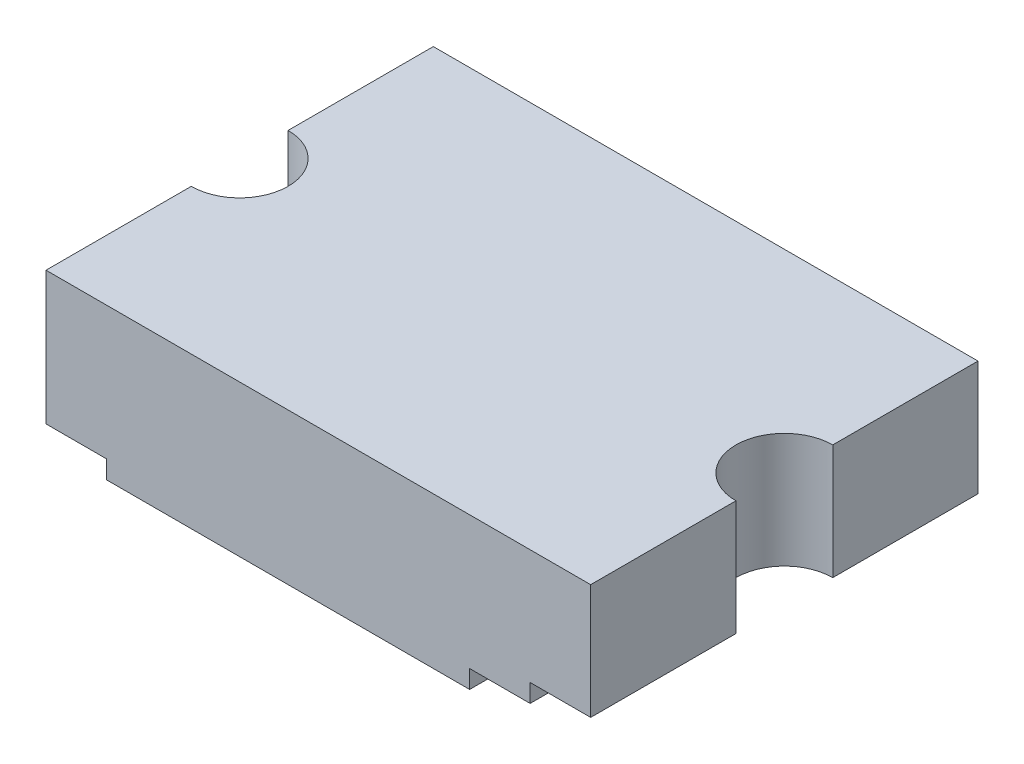
ISO-10303-21;
HEADER;
FILE_DESCRIPTION(('STEP AP214'),'2;1');
FILE_NAME('part.step','',(''),(''),'','','');
FILE_SCHEMA(('AUTOMOTIVE_DESIGN { 1 0 10303 214 1 1 1 1 }'));
ENDSEC;
DATA;
#1=APPLICATION_CONTEXT('core data for automotive mechanical design processes');
#2=APPLICATION_PROTOCOL_DEFINITION('international standard','automotive_design',2000,#1);
#3=PRODUCT_CONTEXT('',#1,'mechanical');
#4=PRODUCT('Part','Part','',(#3));
#5=PRODUCT_RELATED_PRODUCT_CATEGORY('part','',(#4));
#6=PRODUCT_DEFINITION_FORMATION('','',#4);
#7=PRODUCT_DEFINITION_CONTEXT('part definition',#1,'design');
#8=PRODUCT_DEFINITION('design','',#6,#7);
#9=PRODUCT_DEFINITION_SHAPE('','',#8);
#10=(LENGTH_UNIT() NAMED_UNIT(*) SI_UNIT(.MILLI.,.METRE.));
#11=(NAMED_UNIT(*) PLANE_ANGLE_UNIT() SI_UNIT($,.RADIAN.));
#12=(NAMED_UNIT(*) SI_UNIT($,.STERADIAN.) SOLID_ANGLE_UNIT());
#13=UNCERTAINTY_MEASURE_WITH_UNIT(LENGTH_MEASURE(1.E-05),#10,'distance_accuracy_value','');
#14=(GEOMETRIC_REPRESENTATION_CONTEXT(3) GLOBAL_UNCERTAINTY_ASSIGNED_CONTEXT((#13)) GLOBAL_UNIT_ASSIGNED_CONTEXT((#10,
#11,#12)) REPRESENTATION_CONTEXT('',''));
#15=CARTESIAN_POINT('',(0.,0.,0.));
#16=DIRECTION('',(0.,0.,1.));
#17=DIRECTION('',(1.,0.,0.));
#18=AXIS2_PLACEMENT_3D('',#15,#16,#17);
#19=CARTESIAN_POINT('',(2.25,-0.325,0.));
#20=DIRECTION('',(0.,-1.,0.));
#21=DIRECTION('',(0.,0.,-1.));
#22=AXIS2_PLACEMENT_3D('',#19,#20,#21);
#23=PLANE('',#22);
#24=DIRECTION('',(1.,0.,0.));
#25=VECTOR('',#24,1.);
#26=CARTESIAN_POINT('',(2.25,-0.325,-1.6));
#27=LINE('',#26,#25);
#28=CARTESIAN_POINT('',(1.75,-0.325,-1.6));
#29=VERTEX_POINT('',#28);
#30=CARTESIAN_POINT('',(2.25,-0.325,-1.6));
#31=VERTEX_POINT('',#30);
#32=EDGE_CURVE('E171',#29,#31,#27,.T.);
#33=ORIENTED_EDGE('',*,*,#32,.T.);
#34=DIRECTION('',(0.,0.,-1.));
#35=VECTOR('',#34,1.);
#36=CARTESIAN_POINT('',(2.25,-0.325,0.));
#37=LINE('',#36,#35);
#38=CARTESIAN_POINT('',(2.25,-0.325,-0.400000000000002));
#39=VERTEX_POINT('',#38);
#40=EDGE_CURVE('E169',#31,#39,#37,.F.);
#41=ORIENTED_EDGE('',*,*,#40,.T.);
#42=CARTESIAN_POINT('',(2.25,-0.325,0.));
#43=DIRECTION('',(0.,1.,0.));
#44=DIRECTION('',(0.,0.,1.));
#45=AXIS2_PLACEMENT_3D('',#42,#43,#44);
#46=CIRCLE('',#45,0.4);
#47=CARTESIAN_POINT('',(2.25,-0.325,0.399999999999999));
#48=VERTEX_POINT('',#47);
#49=EDGE_CURVE('E20',#39,#48,#46,.T.);
#50=ORIENTED_EDGE('',*,*,#49,.T.);
#51=DIRECTION('',(0.,0.,-1.));
#52=VECTOR('',#51,1.);
#53=CARTESIAN_POINT('',(2.25,-0.325,0.));
#54=LINE('',#53,#52);
#55=CARTESIAN_POINT('',(2.25,-0.325,1.6));
#56=VERTEX_POINT('',#55);
#57=EDGE_CURVE('E156',#48,#56,#54,.F.);
#58=ORIENTED_EDGE('',*,*,#57,.T.);
#59=DIRECTION('',(1.,0.,0.));
#60=VECTOR('',#59,1.);
#61=CARTESIAN_POINT('',(2.25,-0.325,1.6));
#62=LINE('',#61,#60);
#63=CARTESIAN_POINT('',(1.75,-0.325,1.6));
#64=VERTEX_POINT('',#63);
#65=EDGE_CURVE('E161',#56,#64,#62,.F.);
#66=ORIENTED_EDGE('',*,*,#65,.T.);
#67=DIRECTION('',(0.,0.,-1.));
#68=VECTOR('',#67,1.);
#69=CARTESIAN_POINT('',(1.75,-0.325,0.));
#70=LINE('',#69,#68);
#71=CARTESIAN_POINT('',(1.75,-0.325,0.748331477354788));
#72=VERTEX_POINT('',#71);
#73=EDGE_CURVE('E187',#64,#72,#70,.T.);
#74=ORIENTED_EDGE('',*,*,#73,.T.);
#75=CARTESIAN_POINT('',(2.25,-0.325,0.));
#76=DIRECTION('',(0.,-1.,0.));
#77=DIRECTION('',(0.,0.,-1.));
#78=AXIS2_PLACEMENT_3D('',#75,#76,#77);
#79=CIRCLE('',#78,0.9);
#80=CARTESIAN_POINT('',(1.75,-0.325,-0.74833147735479));
#81=VERTEX_POINT('',#80);
#82=EDGE_CURVE('E176',#72,#81,#79,.T.);
#83=ORIENTED_EDGE('',*,*,#82,.T.);
#84=DIRECTION('',(0.,0.,-1.));
#85=VECTOR('',#84,1.);
#86=CARTESIAN_POINT('',(1.75,-0.325,0.));
#87=LINE('',#86,#85);
#88=EDGE_CURVE('E178',#81,#29,#87,.T.);
#89=ORIENTED_EDGE('',*,*,#88,.T.);
#90=EDGE_LOOP('',(#33,#41,#50,#58,#66,#74,#83,#89));
#91=FACE_BOUND('',#90,.T.);
#92=ADVANCED_FACE('F17',(#91),#23,.T.);
#93=CARTESIAN_POINT('',(2.25,-0.325,0.));
#94=DIRECTION('',(0.,-1.,0.));
#95=DIRECTION('',(0.,0.,-1.));
#96=AXIS2_PLACEMENT_3D('',#93,#94,#95);
#97=CYLINDRICAL_SURFACE('',#96,0.9);
#98=DIRECTION('',(0.,-1.,0.));
#99=VECTOR('',#98,1.);
#100=CARTESIAN_POINT('',(1.75,-0.325,-0.74833147735479));
#101=LINE('',#100,#99);
#102=CARTESIAN_POINT('',(1.75,-0.475,-0.74833147735479));
#103=VERTEX_POINT('',#102);
#104=EDGE_CURVE('E233',#81,#103,#101,.T.);
#105=ORIENTED_EDGE('',*,*,#104,.F.);
#106=ORIENTED_EDGE('',*,*,#82,.F.);
#107=DIRECTION('',(0.,-1.,0.));
#108=VECTOR('',#107,1.);
#109=CARTESIAN_POINT('',(1.75,-0.325,0.748331477354788));
#110=LINE('',#109,#108);
#111=CARTESIAN_POINT('',(1.75,-0.475,0.748331477354788));
#112=VERTEX_POINT('',#111);
#113=EDGE_CURVE('E174',#112,#72,#110,.F.);
#114=ORIENTED_EDGE('',*,*,#113,.F.);
#115=CARTESIAN_POINT('',(2.25,-0.475,0.));
#116=DIRECTION('',(0.,-1.,0.));
#117=DIRECTION('',(0.,0.,-1.));
#118=AXIS2_PLACEMENT_3D('',#115,#116,#117);
#119=CIRCLE('',#118,0.9);
#120=EDGE_CURVE('E228',#103,#112,#119,.F.);
#121=ORIENTED_EDGE('',*,*,#120,.F.);
#122=EDGE_LOOP('',(#105,#106,#114,#121));
#123=FACE_BOUND('',#122,.T.);
#124=ADVANCED_FACE('F616',(#123),#97,.F.);
#125=CARTESIAN_POINT('',(2.25,-0.475,0.));
#126=DIRECTION('',(0.,-1.,0.));
#127=DIRECTION('',(0.,0.,-1.));
#128=AXIS2_PLACEMENT_3D('',#125,#126,#127);
#129=PLANE('',#128);
#130=DIRECTION('',(0.,0.,-1.));
#131=VECTOR('',#130,1.);
#132=CARTESIAN_POINT('',(1.25,-0.475,0.));
#133=LINE('',#132,#131);
#134=CARTESIAN_POINT('',(1.25,-0.475,-0.979795897113274));
#135=VERTEX_POINT('',#134);
#136=CARTESIAN_POINT('',(1.25,-0.475,-1.6));
#137=VERTEX_POINT('',#136);
#138=EDGE_CURVE('E294',#135,#137,#133,.T.);
#139=ORIENTED_EDGE('',*,*,#138,.T.);
#140=DIRECTION('',(1.,0.,0.));
#141=VECTOR('',#140,1.);
#142=CARTESIAN_POINT('',(2.25,-0.475,-1.6));
#143=LINE('',#142,#141);
#144=CARTESIAN_POINT('',(1.75,-0.475,-1.6));
#145=VERTEX_POINT('',#144);
#146=EDGE_CURVE('E291',#137,#145,#143,.T.);
#147=ORIENTED_EDGE('',*,*,#146,.T.);
#148=DIRECTION('',(0.,0.,-1.));
#149=VECTOR('',#148,1.);
#150=CARTESIAN_POINT('',(1.75,-0.475,0.));
#151=LINE('',#150,#149);
#152=EDGE_CURVE('E231',#145,#103,#151,.F.);
#153=ORIENTED_EDGE('',*,*,#152,.T.);
#154=ORIENTED_EDGE('',*,*,#120,.T.);
#155=DIRECTION('',(0.,0.,-1.));
#156=VECTOR('',#155,1.);
#157=CARTESIAN_POINT('',(1.75,-0.475,0.));
#158=LINE('',#157,#156);
#159=CARTESIAN_POINT('',(1.75,-0.475,1.6));
#160=VERTEX_POINT('',#159);
#161=EDGE_CURVE('E230',#112,#160,#158,.F.);
#162=ORIENTED_EDGE('',*,*,#161,.T.);
#163=DIRECTION('',(1.,0.,0.));
#164=VECTOR('',#163,1.);
#165=CARTESIAN_POINT('',(2.25,-0.475,1.6));
#166=LINE('',#165,#164);
#167=CARTESIAN_POINT('',(1.25,-0.475,1.6));
#168=VERTEX_POINT('',#167);
#169=EDGE_CURVE('E300',#160,#168,#166,.F.);
#170=ORIENTED_EDGE('',*,*,#169,.T.);
#171=DIRECTION('',(0.,0.,-1.));
#172=VECTOR('',#171,1.);
#173=CARTESIAN_POINT('',(1.25,-0.475,0.));
#174=LINE('',#173,#172);
#175=CARTESIAN_POINT('',(1.25,-0.475,0.979795897113272));
#176=VERTEX_POINT('',#175);
#177=EDGE_CURVE('E296',#168,#176,#174,.T.);
#178=ORIENTED_EDGE('',*,*,#177,.T.);
#179=CARTESIAN_POINT('',(2.25,-0.475,0.));
#180=DIRECTION('',(0.,-1.,0.));
#181=DIRECTION('',(0.,0.,-1.));
#182=AXIS2_PLACEMENT_3D('',#179,#180,#181);
#183=CIRCLE('',#182,1.4);
#184=EDGE_CURVE('E221',#176,#135,#183,.T.);
#185=ORIENTED_EDGE('',*,*,#184,.T.);
#186=EDGE_LOOP('',(#139,#147,#153,#154,#162,#170,#178,#185));
#187=FACE_BOUND('',#186,.T.);
#188=ADVANCED_FACE('F396',(#187),#129,.T.);
#189=CARTESIAN_POINT('',(-2.25,-0.475,0.));
#190=DIRECTION('',(0.,-1.,0.));
#191=DIRECTION('',(0.,0.,-1.));
#192=AXIS2_PLACEMENT_3D('',#189,#190,#191);
#193=PLANE('',#192);
#194=DIRECTION('',(0.,0.,-1.));
#195=VECTOR('',#194,1.);
#196=CARTESIAN_POINT('',(-2.25,-0.475,0.));
#197=LINE('',#196,#195);
#198=CARTESIAN_POINT('',(-2.25,-0.475,1.6));
#199=VERTEX_POINT('',#198);
#200=CARTESIAN_POINT('',(-2.25,-0.475,0.4));
#201=VERTEX_POINT('',#200);
#202=EDGE_CURVE('E227',#199,#201,#197,.T.);
#203=ORIENTED_EDGE('',*,*,#202,.T.);
#204=CARTESIAN_POINT('',(-2.25,-0.475,0.));
#205=DIRECTION('',(0.,1.,0.));
#206=DIRECTION('',(0.,0.,1.));
#207=AXIS2_PLACEMENT_3D('',#204,#205,#206);
#208=CIRCLE('',#207,0.4);
#209=CARTESIAN_POINT('',(-2.25,-0.475,-0.4));
#210=VERTEX_POINT('',#209);
#211=EDGE_CURVE('E224',#201,#210,#208,.T.);
#212=ORIENTED_EDGE('',*,*,#211,.T.);
#213=DIRECTION('',(0.,0.,-1.));
#214=VECTOR('',#213,1.);
#215=CARTESIAN_POINT('',(-2.25,-0.475,0.));
#216=LINE('',#215,#214);
#217=CARTESIAN_POINT('',(-2.25,-0.475,-1.6));
#218=VERTEX_POINT('',#217);
#219=EDGE_CURVE('E288',#210,#218,#216,.T.);
#220=ORIENTED_EDGE('',*,*,#219,.T.);
#221=DIRECTION('',(1.,0.,0.));
#222=VECTOR('',#221,1.);
#223=CARTESIAN_POINT('',(-2.25,-0.475,-1.6));
#224=LINE('',#223,#222);
#225=CARTESIAN_POINT('',(-1.75,-0.475,-1.6));
#226=VERTEX_POINT('',#225);
#227=EDGE_CURVE('E285',#218,#226,#224,.T.);
#228=ORIENTED_EDGE('',*,*,#227,.T.);
#229=DIRECTION('',(0.,0.,-1.));
#230=VECTOR('',#229,1.);
#231=CARTESIAN_POINT('',(-1.75,-0.475,0.));
#232=LINE('',#231,#230);
#233=CARTESIAN_POINT('',(-1.75,-0.475,-0.748331477354788));
#234=VERTEX_POINT('',#233);
#235=EDGE_CURVE('E281',#226,#234,#232,.F.);
#236=ORIENTED_EDGE('',*,*,#235,.T.);
#237=CARTESIAN_POINT('',(-2.25,-0.475,0.));
#238=DIRECTION('',(0.,-1.,0.));
#239=DIRECTION('',(0.,0.,-1.));
#240=AXIS2_PLACEMENT_3D('',#237,#238,#239);
#241=CIRCLE('',#240,0.9);
#242=CARTESIAN_POINT('',(-1.75,-0.475,0.748331477354788));
#243=VERTEX_POINT('',#242);
#244=EDGE_CURVE('E217',#234,#243,#241,.T.);
#245=ORIENTED_EDGE('',*,*,#244,.T.);
#246=DIRECTION('',(0.,0.,-1.));
#247=VECTOR('',#246,1.);
#248=CARTESIAN_POINT('',(-1.75,-0.475,0.));
#249=LINE('',#248,#247);
#250=CARTESIAN_POINT('',(-1.75,-0.475,1.6));
#251=VERTEX_POINT('',#250);
#252=EDGE_CURVE('E278',#243,#251,#249,.F.);
#253=ORIENTED_EDGE('',*,*,#252,.T.);
#254=DIRECTION('',(1.,0.,0.));
#255=VECTOR('',#254,1.);
#256=CARTESIAN_POINT('',(-2.25,-0.475,1.6));
#257=LINE('',#256,#255);
#258=EDGE_CURVE('E275',#251,#199,#257,.F.);
#259=ORIENTED_EDGE('',*,*,#258,.T.);
#260=EDGE_LOOP('',(#203,#212,#220,#228,#236,#245,#253,#259));
#261=FACE_BOUND('',#260,.T.);
#262=ADVANCED_FACE('F414',(#261),#193,.T.);
#263=CARTESIAN_POINT('',(2.25,-0.475,0.));
#264=DIRECTION('',(0.,-1.,0.));
#265=DIRECTION('',(0.,0.,-1.));
#266=AXIS2_PLACEMENT_3D('',#263,#264,#265);
#267=CYLINDRICAL_SURFACE('',#266,1.4);
#268=DIRECTION('',(0.,1.,0.));
#269=VECTOR('',#268,1.);
#270=CARTESIAN_POINT('',(1.25,-0.475,-0.979795897113274));
#271=LINE('',#270,#269);
#272=CARTESIAN_POINT('',(1.25,-0.625,-0.979795897113274));
#273=VERTEX_POINT('',#272);
#274=EDGE_CURVE('E260',#273,#135,#271,.T.);
#275=ORIENTED_EDGE('',*,*,#274,.T.);
#276=ORIENTED_EDGE('',*,*,#184,.F.);
#277=DIRECTION('',(0.,1.,0.));
#278=VECTOR('',#277,1.);
#279=CARTESIAN_POINT('',(1.25,-0.475,0.979795897113272));
#280=LINE('',#279,#278);
#281=CARTESIAN_POINT('',(1.25,-0.625,0.979795897113272));
#282=VERTEX_POINT('',#281);
#283=EDGE_CURVE('E264',#176,#282,#280,.F.);
#284=ORIENTED_EDGE('',*,*,#283,.T.);
#285=CARTESIAN_POINT('',(2.25,-0.625,0.));
#286=DIRECTION('',(0.,-1.,0.));
#287=DIRECTION('',(0.,0.,-1.));
#288=AXIS2_PLACEMENT_3D('',#285,#286,#287);
#289=CIRCLE('',#288,1.4);
#290=EDGE_CURVE('E213',#282,#273,#289,.T.);
#291=ORIENTED_EDGE('',*,*,#290,.T.);
#292=EDGE_LOOP('',(#275,#276,#284,#291));
#293=FACE_BOUND('',#292,.T.);
#294=ADVANCED_FACE('F402',(#293),#267,.F.);
#295=CARTESIAN_POINT('',(-2.25,-0.475,0.));
#296=DIRECTION('',(0.,-1.,0.));
#297=DIRECTION('',(0.,0.,-1.));
#298=AXIS2_PLACEMENT_3D('',#295,#296,#297);
#299=CYLINDRICAL_SURFACE('',#298,0.9);
#300=DIRECTION('',(0.,-1.,0.));
#301=VECTOR('',#300,1.);
#302=CARTESIAN_POINT('',(-1.75,-0.475,0.748331477354788));
#303=LINE('',#302,#301);
#304=CARTESIAN_POINT('',(-1.75,-0.625,0.748331477354788));
#305=VERTEX_POINT('',#304);
#306=EDGE_CURVE('E220',#243,#305,#303,.T.);
#307=ORIENTED_EDGE('',*,*,#306,.F.);
#308=ORIENTED_EDGE('',*,*,#244,.F.);
#309=DIRECTION('',(0.,1.,0.));
#310=VECTOR('',#309,1.);
#311=CARTESIAN_POINT('',(-1.75,-0.475,-0.748331477354788));
#312=LINE('',#311,#310);
#313=CARTESIAN_POINT('',(-1.75,-0.625,-0.748331477354788));
#314=VERTEX_POINT('',#313);
#315=EDGE_CURVE('E266',#234,#314,#312,.F.);
#316=ORIENTED_EDGE('',*,*,#315,.T.);
#317=CARTESIAN_POINT('',(-2.25,-0.625,0.));
#318=DIRECTION('',(0.,-1.,0.));
#319=DIRECTION('',(0.,0.,-1.));
#320=AXIS2_PLACEMENT_3D('',#317,#318,#319);
#321=CIRCLE('',#320,0.9);
#322=EDGE_CURVE('E208',#314,#305,#321,.T.);
#323=ORIENTED_EDGE('',*,*,#322,.T.);
#324=EDGE_LOOP('',(#307,#308,#316,#323));
#325=FACE_BOUND('',#324,.T.);
#326=ADVANCED_FACE('F419',(#325),#299,.F.);
#327=CARTESIAN_POINT('',(1.25,-0.475,-0.979795897113274));
#328=DIRECTION('',(-1.,0.,0.));
#329=DIRECTION('',(0.,0.,1.));
#330=AXIS2_PLACEMENT_3D('',#327,#328,#329);
#331=PLANE('',#330);
#332=DIRECTION('',(0.,1.,0.));
#333=VECTOR('',#332,1.);
#334=CARTESIAN_POINT('',(1.25,0.625,-1.6));
#335=LINE('',#334,#333);
#336=CARTESIAN_POINT('',(1.25,-0.625,-1.6));
#337=VERTEX_POINT('',#336);
#338=EDGE_CURVE('E247',#337,#137,#335,.T.);
#339=ORIENTED_EDGE('',*,*,#338,.T.);
#340=ORIENTED_EDGE('',*,*,#138,.F.);
#341=ORIENTED_EDGE('',*,*,#274,.F.);
#342=DIRECTION('',(0.,0.,1.));
#343=VECTOR('',#342,1.);
#344=CARTESIAN_POINT('',(1.25,-0.625,1.6));
#345=LINE('',#344,#343);
#346=EDGE_CURVE('E215',#273,#337,#345,.F.);
#347=ORIENTED_EDGE('',*,*,#346,.T.);
#348=EDGE_LOOP('',(#339,#340,#341,#347));
#349=FACE_BOUND('',#348,.T.);
#350=ADVANCED_FACE('F400',(#349),#331,.F.);
#351=CARTESIAN_POINT('',(1.75,-0.325,-0.74833147735479));
#352=DIRECTION('',(-1.,0.,0.));
#353=DIRECTION('',(0.,0.,1.));
#354=AXIS2_PLACEMENT_3D('',#351,#352,#353);
#355=PLANE('',#354);
#356=DIRECTION('',(0.,1.,0.));
#357=VECTOR('',#356,1.);
#358=CARTESIAN_POINT('',(1.75,0.625,-1.6));
#359=LINE('',#358,#357);
#360=EDGE_CURVE('E244',#145,#29,#359,.T.);
#361=ORIENTED_EDGE('',*,*,#360,.T.);
#362=ORIENTED_EDGE('',*,*,#88,.F.);
#363=ORIENTED_EDGE('',*,*,#104,.T.);
#364=ORIENTED_EDGE('',*,*,#152,.F.);
#365=EDGE_LOOP('',(#361,#362,#363,#364));
#366=FACE_BOUND('',#365,.T.);
#367=ADVANCED_FACE('F567',(#366),#355,.F.);
#368=CARTESIAN_POINT('',(-1.75,-0.475,-1.6));
#369=DIRECTION('',(1.,0.,0.));
#370=DIRECTION('',(0.,0.,-1.));
#371=AXIS2_PLACEMENT_3D('',#368,#369,#370);
#372=PLANE('',#371);
#373=ORIENTED_EDGE('',*,*,#315,.F.);
#374=ORIENTED_EDGE('',*,*,#235,.F.);
#375=DIRECTION('',(0.,1.,0.));
#376=VECTOR('',#375,1.);
#377=CARTESIAN_POINT('',(-1.75,0.625,-1.6));
#378=LINE('',#377,#376);
#379=CARTESIAN_POINT('',(-1.75,-0.625,-1.6));
#380=VERTEX_POINT('',#379);
#381=EDGE_CURVE('E249',#226,#380,#378,.F.);
#382=ORIENTED_EDGE('',*,*,#381,.T.);
#383=DIRECTION('',(0.,0.,1.));
#384=VECTOR('',#383,1.);
#385=CARTESIAN_POINT('',(-1.75,-0.625,1.6));
#386=LINE('',#385,#384);
#387=EDGE_CURVE('E212',#380,#314,#386,.T.);
#388=ORIENTED_EDGE('',*,*,#387,.T.);
#389=EDGE_LOOP('',(#373,#374,#382,#388));
#390=FACE_BOUND('',#389,.T.);
#391=ADVANCED_FACE('F421',(#390),#372,.F.);
#392=CARTESIAN_POINT('',(1.75,-0.325,1.6));
#393=DIRECTION('',(-1.,0.,0.));
#394=DIRECTION('',(0.,0.,1.));
#395=AXIS2_PLACEMENT_3D('',#392,#393,#394);
#396=PLANE('',#395);
#397=ORIENTED_EDGE('',*,*,#113,.T.);
#398=ORIENTED_EDGE('',*,*,#73,.F.);
#399=DIRECTION('',(0.,1.,0.));
#400=VECTOR('',#399,1.);
#401=CARTESIAN_POINT('',(1.75,0.625,1.6));
#402=LINE('',#401,#400);
#403=EDGE_CURVE('E270',#64,#160,#402,.F.);
#404=ORIENTED_EDGE('',*,*,#403,.T.);
#405=ORIENTED_EDGE('',*,*,#161,.F.);
#406=EDGE_LOOP('',(#397,#398,#404,#405));
#407=FACE_BOUND('',#406,.T.);
#408=ADVANCED_FACE('F550',(#407),#396,.F.);
#409=CARTESIAN_POINT('',(1.25,-0.475,1.6));
#410=DIRECTION('',(-1.,0.,0.));
#411=DIRECTION('',(0.,0.,1.));
#412=AXIS2_PLACEMENT_3D('',#409,#410,#411);
#413=PLANE('',#412);
#414=ORIENTED_EDGE('',*,*,#283,.F.);
#415=ORIENTED_EDGE('',*,*,#177,.F.);
#416=DIRECTION('',(0.,1.,0.));
#417=VECTOR('',#416,1.);
#418=CARTESIAN_POINT('',(1.25,0.625,1.6));
#419=LINE('',#418,#417);
#420=CARTESIAN_POINT('',(1.25,-0.625,1.6));
#421=VERTEX_POINT('',#420);
#422=EDGE_CURVE('E267',#168,#421,#419,.F.);
#423=ORIENTED_EDGE('',*,*,#422,.T.);
#424=DIRECTION('',(0.,0.,1.));
#425=VECTOR('',#424,1.);
#426=CARTESIAN_POINT('',(1.25,-0.625,1.6));
#427=LINE('',#426,#425);
#428=EDGE_CURVE('E216',#421,#282,#427,.F.);
#429=ORIENTED_EDGE('',*,*,#428,.T.);
#430=EDGE_LOOP('',(#414,#415,#423,#429));
#431=FACE_BOUND('',#430,.T.);
#432=ADVANCED_FACE('F540',(#431),#413,.F.);
#433=CARTESIAN_POINT('',(-2.25,-0.625,1.6));
#434=DIRECTION('',(0.,1.,0.));
#435=DIRECTION('',(0.,0.,1.));
#436=AXIS2_PLACEMENT_3D('',#433,#434,#435);
#437=PLANE('',#436);
#438=DIRECTION('',(0.,0.,-1.));
#439=VECTOR('',#438,1.);
#440=CARTESIAN_POINT('',(-1.75,-0.625,0.748331477354788));
#441=LINE('',#440,#439);
#442=CARTESIAN_POINT('',(-1.75,-0.625,1.6));
#443=VERTEX_POINT('',#442);
#444=EDGE_CURVE('E211',#443,#305,#441,.T.);
#445=ORIENTED_EDGE('',*,*,#444,.T.);
#446=ORIENTED_EDGE('',*,*,#322,.F.);
#447=ORIENTED_EDGE('',*,*,#387,.F.);
#448=DIRECTION('',(1.,0.,0.));
#449=VECTOR('',#448,1.);
#450=CARTESIAN_POINT('',(-2.25,-0.625,-1.6));
#451=LINE('',#450,#449);
#452=EDGE_CURVE('E345',#380,#337,#451,.T.);
#453=ORIENTED_EDGE('',*,*,#452,.T.);
#454=ORIENTED_EDGE('',*,*,#346,.F.);
#455=ORIENTED_EDGE('',*,*,#290,.F.);
#456=ORIENTED_EDGE('',*,*,#428,.F.);
#457=DIRECTION('',(-1.,0.,0.));
#458=VECTOR('',#457,1.);
#459=CARTESIAN_POINT('',(-2.25,-0.625,1.6));
#460=LINE('',#459,#458);
#461=EDGE_CURVE('E269',#421,#443,#460,.T.);
#462=ORIENTED_EDGE('',*,*,#461,.T.);
#463=EDGE_LOOP('',(#445,#446,#447,#453,#454,#455,#456,#462));
#464=FACE_BOUND('',#463,.T.);
#465=ADVANCED_FACE('F389',(#464),#437,.F.);
#466=CARTESIAN_POINT('',(-1.75,-0.475,0.748331477354788));
#467=DIRECTION('',(1.,0.,0.));
#468=DIRECTION('',(0.,0.,-1.));
#469=AXIS2_PLACEMENT_3D('',#466,#467,#468);
#470=PLANE('',#469);
#471=DIRECTION('',(0.,1.,0.));
#472=VECTOR('',#471,1.);
#473=CARTESIAN_POINT('',(-1.75,0.625,1.6));
#474=LINE('',#473,#472);
#475=EDGE_CURVE('E371',#443,#251,#474,.T.);
#476=ORIENTED_EDGE('',*,*,#475,.T.);
#477=ORIENTED_EDGE('',*,*,#252,.F.);
#478=ORIENTED_EDGE('',*,*,#306,.T.);
#479=ORIENTED_EDGE('',*,*,#444,.F.);
#480=EDGE_LOOP('',(#476,#477,#478,#479));
#481=FACE_BOUND('',#480,.T.);
#482=ADVANCED_FACE('F412',(#481),#470,.F.);
#483=CARTESIAN_POINT('',(2.25,-0.625,0.));
#484=DIRECTION('',(0.,1.,0.));
#485=DIRECTION('',(0.,0.,1.));
#486=AXIS2_PLACEMENT_3D('',#483,#484,#485);
#487=CYLINDRICAL_SURFACE('',#486,0.4);
#488=DIRECTION('',(0.,1.,0.));
#489=VECTOR('',#488,1.);
#490=CARTESIAN_POINT('',(2.25,0.625,-0.400000000000002));
#491=LINE('',#490,#489);
#492=CARTESIAN_POINT('',(2.25,0.625,-0.400000000000002));
#493=VERTEX_POINT('',#492);
#494=EDGE_CURVE('E252',#39,#493,#491,.T.);
#495=ORIENTED_EDGE('',*,*,#494,.T.);
#496=CARTESIAN_POINT('',(2.25,0.625,0.));
#497=DIRECTION('',(0.,1.,0.));
#498=DIRECTION('',(0.,0.,1.));
#499=AXIS2_PLACEMENT_3D('',#496,#497,#498);
#500=CIRCLE('',#499,0.4);
#501=CARTESIAN_POINT('',(2.25,0.625,0.399999999999999));
#502=VERTEX_POINT('',#501);
#503=EDGE_CURVE('E165',#502,#493,#500,.F.);
#504=ORIENTED_EDGE('',*,*,#503,.F.);
#505=DIRECTION('',(0.,1.,0.));
#506=VECTOR('',#505,1.);
#507=CARTESIAN_POINT('',(2.25,0.625,0.399999999999999));
#508=LINE('',#507,#506);
#509=EDGE_CURVE('E158',#502,#48,#508,.F.);
#510=ORIENTED_EDGE('',*,*,#509,.T.);
#511=ORIENTED_EDGE('',*,*,#49,.F.);
#512=EDGE_LOOP('',(#495,#504,#510,#511));
#513=FACE_BOUND('',#512,.T.);
#514=ADVANCED_FACE('F163',(#513),#487,.F.);
#515=CARTESIAN_POINT('',(2.25,0.625,-1.6));
#516=DIRECTION('',(-1.,0.,0.));
#517=DIRECTION('',(0.,0.,1.));
#518=AXIS2_PLACEMENT_3D('',#515,#516,#517);
#519=PLANE('',#518);
#520=DIRECTION('',(0.,1.,0.));
#521=VECTOR('',#520,1.);
#522=CARTESIAN_POINT('',(2.25,0.625,-1.6));
#523=LINE('',#522,#521);
#524=CARTESIAN_POINT('',(2.25,0.625,-1.6));
#525=VERTEX_POINT('',#524);
#526=EDGE_CURVE('E246',#31,#525,#523,.T.);
#527=ORIENTED_EDGE('',*,*,#526,.T.);
#528=DIRECTION('',(0.,0.,1.));
#529=VECTOR('',#528,1.);
#530=CARTESIAN_POINT('',(2.25,0.625,1.6));
#531=LINE('',#530,#529);
#532=EDGE_CURVE('E207',#493,#525,#531,.F.);
#533=ORIENTED_EDGE('',*,*,#532,.F.);
#534=ORIENTED_EDGE('',*,*,#494,.F.);
#535=ORIENTED_EDGE('',*,*,#40,.F.);
#536=EDGE_LOOP('',(#527,#533,#534,#535));
#537=FACE_BOUND('',#536,.T.);
#538=ADVANCED_FACE('F506',(#537),#519,.F.);
#539=CARTESIAN_POINT('',(-2.25,0.625,-1.6));
#540=DIRECTION('',(0.,0.,1.));
#541=DIRECTION('',(1.,0.,0.));
#542=AXIS2_PLACEMENT_3D('',#539,#540,#541);
#543=PLANE('',#542);
#544=ORIENTED_EDGE('',*,*,#381,.F.);
#545=ORIENTED_EDGE('',*,*,#227,.F.);
#546=DIRECTION('',(0.,1.,0.));
#547=VECTOR('',#546,1.);
#548=CARTESIAN_POINT('',(-2.25,0.625,-1.6));
#549=LINE('',#548,#547);
#550=CARTESIAN_POINT('',(-2.25,0.625,-1.6));
#551=VERTEX_POINT('',#550);
#552=EDGE_CURVE('E343',#218,#551,#549,.T.);
#553=ORIENTED_EDGE('',*,*,#552,.T.);
#554=DIRECTION('',(1.,0.,0.));
#555=VECTOR('',#554,1.);
#556=CARTESIAN_POINT('',(-2.25,0.625,-1.6));
#557=LINE('',#556,#555);
#558=EDGE_CURVE('E348',#525,#551,#557,.F.);
#559=ORIENTED_EDGE('',*,*,#558,.F.);
#560=ORIENTED_EDGE('',*,*,#526,.F.);
#561=ORIENTED_EDGE('',*,*,#32,.F.);
#562=ORIENTED_EDGE('',*,*,#360,.F.);
#563=ORIENTED_EDGE('',*,*,#146,.F.);
#564=ORIENTED_EDGE('',*,*,#338,.F.);
#565=ORIENTED_EDGE('',*,*,#452,.F.);
#566=EDGE_LOOP('',(#544,#545,#553,#559,#560,#561,#562,#563,#564,#565));
#567=FACE_BOUND('',#566,.T.);
#568=ADVANCED_FACE('F394',(#567),#543,.F.);
#569=CARTESIAN_POINT('',(-2.25,0.625,-1.6));
#570=DIRECTION('',(1.,0.,0.));
#571=DIRECTION('',(0.,0.,-1.));
#572=AXIS2_PLACEMENT_3D('',#569,#570,#571);
#573=PLANE('',#572);
#574=DIRECTION('',(0.,1.,0.));
#575=VECTOR('',#574,1.);
#576=CARTESIAN_POINT('',(-2.25,-0.625,-0.4));
#577=LINE('',#576,#575);
#578=CARTESIAN_POINT('',(-2.25,0.625,-0.4));
#579=VERTEX_POINT('',#578);
#580=EDGE_CURVE('E334',#210,#579,#577,.T.);
#581=ORIENTED_EDGE('',*,*,#580,.T.);
#582=DIRECTION('',(0.,0.,1.));
#583=VECTOR('',#582,1.);
#584=CARTESIAN_POINT('',(-2.25,0.625,1.6));
#585=LINE('',#584,#583);
#586=EDGE_CURVE('E205',#551,#579,#585,.T.);
#587=ORIENTED_EDGE('',*,*,#586,.F.);
#588=ORIENTED_EDGE('',*,*,#552,.F.);
#589=ORIENTED_EDGE('',*,*,#219,.F.);
#590=EDGE_LOOP('',(#581,#587,#588,#589));
#591=FACE_BOUND('',#590,.T.);
#592=ADVANCED_FACE('F425',(#591),#573,.F.);
#593=CARTESIAN_POINT('',(-2.25,-0.625,0.));
#594=DIRECTION('',(0.,1.,0.));
#595=DIRECTION('',(0.,0.,1.));
#596=AXIS2_PLACEMENT_3D('',#593,#594,#595);
#597=CYLINDRICAL_SURFACE('',#596,0.4);
#598=DIRECTION('',(0.,1.,0.));
#599=VECTOR('',#598,1.);
#600=CARTESIAN_POINT('',(-2.25,0.625,0.4));
#601=LINE('',#600,#599);
#602=CARTESIAN_POINT('',(-2.25,0.625,0.4));
#603=VERTEX_POINT('',#602);
#604=EDGE_CURVE('E329',#201,#603,#601,.T.);
#605=ORIENTED_EDGE('',*,*,#604,.T.);
#606=CARTESIAN_POINT('',(-2.25,0.625,0.));
#607=DIRECTION('',(0.,1.,0.));
#608=DIRECTION('',(0.,0.,1.));
#609=AXIS2_PLACEMENT_3D('',#606,#607,#608);
#610=CIRCLE('',#609,0.4);
#611=EDGE_CURVE('E201',#579,#603,#610,.F.);
#612=ORIENTED_EDGE('',*,*,#611,.F.);
#613=ORIENTED_EDGE('',*,*,#580,.F.);
#614=ORIENTED_EDGE('',*,*,#211,.F.);
#615=EDGE_LOOP('',(#605,#612,#613,#614));
#616=FACE_BOUND('',#615,.T.);
#617=ADVANCED_FACE('F429',(#616),#597,.F.);
#618=CARTESIAN_POINT('',(-2.25,0.625,-1.6));
#619=DIRECTION('',(1.,0.,0.));
#620=DIRECTION('',(0.,0.,-1.));
#621=AXIS2_PLACEMENT_3D('',#618,#619,#620);
#622=PLANE('',#621);
#623=DIRECTION('',(0.,1.,0.));
#624=VECTOR('',#623,1.);
#625=CARTESIAN_POINT('',(-2.25,0.625,1.6));
#626=LINE('',#625,#624);
#627=CARTESIAN_POINT('',(-2.25,0.625,1.6));
#628=VERTEX_POINT('',#627);
#629=EDGE_CURVE('E325',#199,#628,#626,.T.);
#630=ORIENTED_EDGE('',*,*,#629,.T.);
#631=DIRECTION('',(0.,0.,1.));
#632=VECTOR('',#631,1.);
#633=CARTESIAN_POINT('',(-2.25,0.625,1.6));
#634=LINE('',#633,#632);
#635=EDGE_CURVE('E204',#603,#628,#634,.T.);
#636=ORIENTED_EDGE('',*,*,#635,.F.);
#637=ORIENTED_EDGE('',*,*,#604,.F.);
#638=ORIENTED_EDGE('',*,*,#202,.F.);
#639=EDGE_LOOP('',(#630,#636,#637,#638));
#640=FACE_BOUND('',#639,.T.);
#641=ADVANCED_FACE('F452',(#640),#622,.F.);
#642=CARTESIAN_POINT('',(-2.25,0.625,1.6));
#643=DIRECTION('',(0.,0.,-1.));
#644=DIRECTION('',(-1.,0.,0.));
#645=AXIS2_PLACEMENT_3D('',#642,#643,#644);
#646=PLANE('',#645);
#647=ORIENTED_EDGE('',*,*,#475,.F.);
#648=ORIENTED_EDGE('',*,*,#461,.F.);
#649=ORIENTED_EDGE('',*,*,#422,.F.);
#650=ORIENTED_EDGE('',*,*,#169,.F.);
#651=ORIENTED_EDGE('',*,*,#403,.F.);
#652=ORIENTED_EDGE('',*,*,#65,.F.);
#653=DIRECTION('',(0.,1.,0.));
#654=VECTOR('',#653,1.);
#655=CARTESIAN_POINT('',(2.25,0.625,1.6));
#656=LINE('',#655,#654);
#657=CARTESIAN_POINT('',(2.25,0.625,1.6));
#658=VERTEX_POINT('',#657);
#659=EDGE_CURVE('E35',#56,#658,#656,.T.);
#660=ORIENTED_EDGE('',*,*,#659,.T.);
#661=DIRECTION('',(1.,0.,0.));
#662=VECTOR('',#661,1.);
#663=CARTESIAN_POINT('',(-2.25,0.625,1.6));
#664=LINE('',#663,#662);
#665=EDGE_CURVE('E26',#628,#658,#664,.T.);
#666=ORIENTED_EDGE('',*,*,#665,.F.);
#667=ORIENTED_EDGE('',*,*,#629,.F.);
#668=ORIENTED_EDGE('',*,*,#258,.F.);
#669=EDGE_LOOP('',(#647,#648,#649,#650,#651,#652,#660,#666,#667,#668));
#670=FACE_BOUND('',#669,.T.);
#671=ADVANCED_FACE('F410',(#670),#646,.F.);
#672=CARTESIAN_POINT('',(2.25,0.625,-1.6));
#673=DIRECTION('',(-1.,0.,0.));
#674=DIRECTION('',(0.,0.,1.));
#675=AXIS2_PLACEMENT_3D('',#672,#673,#674);
#676=PLANE('',#675);
#677=ORIENTED_EDGE('',*,*,#509,.F.);
#678=DIRECTION('',(0.,0.,1.));
#679=VECTOR('',#678,1.);
#680=CARTESIAN_POINT('',(2.25,0.625,1.6));
#681=LINE('',#680,#679);
#682=EDGE_CURVE('E11',#658,#502,#681,.F.);
#683=ORIENTED_EDGE('',*,*,#682,.F.);
#684=ORIENTED_EDGE('',*,*,#659,.F.);
#685=ORIENTED_EDGE('',*,*,#57,.F.);
#686=EDGE_LOOP('',(#677,#683,#684,#685));
#687=FACE_BOUND('',#686,.T.);
#688=ADVANCED_FACE('F157',(#687),#676,.F.);
#689=CARTESIAN_POINT('',(-2.25,0.625,1.6));
#690=DIRECTION('',(0.,1.,0.));
#691=DIRECTION('',(0.,0.,1.));
#692=AXIS2_PLACEMENT_3D('',#689,#690,#691);
#693=PLANE('',#692);
#694=ORIENTED_EDGE('',*,*,#665,.T.);
#695=ORIENTED_EDGE('',*,*,#682,.T.);
#696=ORIENTED_EDGE('',*,*,#503,.T.);
#697=ORIENTED_EDGE('',*,*,#532,.T.);
#698=ORIENTED_EDGE('',*,*,#558,.T.);
#699=ORIENTED_EDGE('',*,*,#586,.T.);
#700=ORIENTED_EDGE('',*,*,#611,.T.);
#701=ORIENTED_EDGE('',*,*,#635,.T.);
#702=EDGE_LOOP('',(#694,#695,#696,#697,#698,#699,#700,#701));
#703=FACE_BOUND('',#702,.T.);
#704=ADVANCED_FACE('F435',(#703),#693,.T.);
#705=CLOSED_SHELL('',(#92,#124,#188,#262,#294,#326,#350,#367,#391,#408,#432,#465,#482,#514,#538,
#568,#592,#617,#641,#671,#688,#704));
#706=MANIFOLD_SOLID_BREP('B1',#705);
#707=ADVANCED_BREP_SHAPE_REPRESENTATION('',(#18,#706),#14);
#708=SHAPE_DEFINITION_REPRESENTATION(#9,#707);
ENDSEC;
END-ISO-10303-21;
